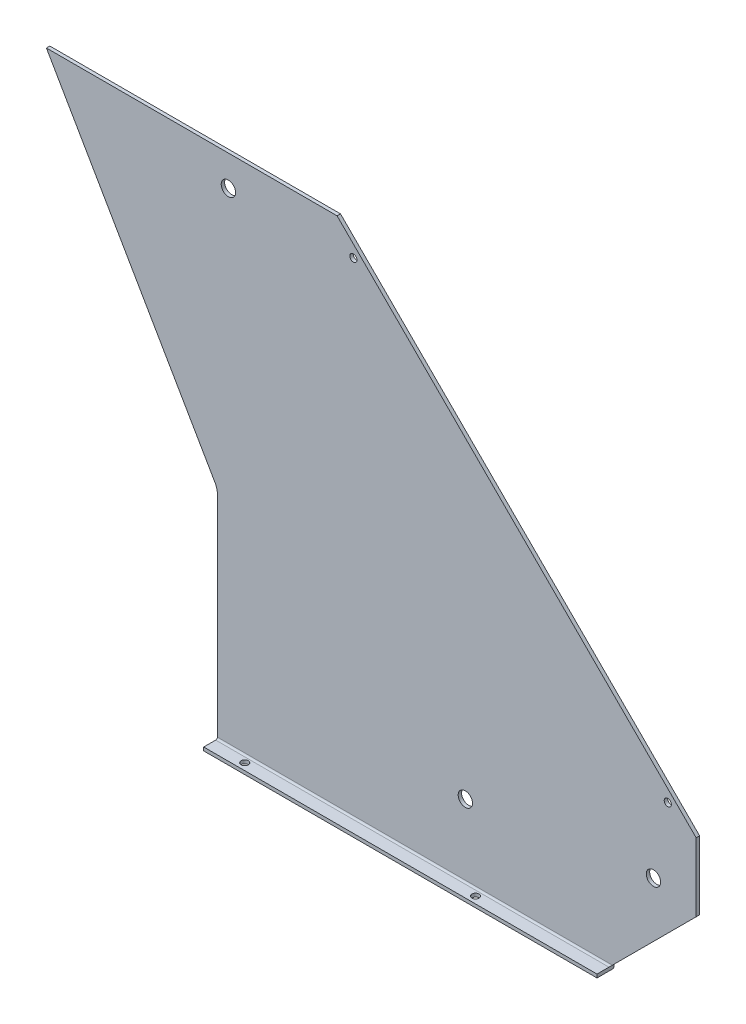
ISO-10303-21;
HEADER;
FILE_DESCRIPTION(('STEP AP214'),'2;1');
FILE_NAME('part.step','',(''),(''),'','','');
FILE_SCHEMA(('AUTOMOTIVE_DESIGN { 1 0 10303 214 1 1 1 1 }'));
ENDSEC;
DATA;
#1=APPLICATION_CONTEXT('core data for automotive mechanical design processes');
#2=APPLICATION_PROTOCOL_DEFINITION('international standard','automotive_design',2000,#1);
#3=PRODUCT_CONTEXT('',#1,'mechanical');
#4=PRODUCT('Part','Part','',(#3));
#5=PRODUCT_RELATED_PRODUCT_CATEGORY('part','',(#4));
#6=PRODUCT_DEFINITION_FORMATION('','',#4);
#7=PRODUCT_DEFINITION_CONTEXT('part definition',#1,'design');
#8=PRODUCT_DEFINITION('design','',#6,#7);
#9=PRODUCT_DEFINITION_SHAPE('','',#8);
#10=(LENGTH_UNIT() NAMED_UNIT(*) SI_UNIT(.MILLI.,.METRE.));
#11=(NAMED_UNIT(*) PLANE_ANGLE_UNIT() SI_UNIT($,.RADIAN.));
#12=(NAMED_UNIT(*) SI_UNIT($,.STERADIAN.) SOLID_ANGLE_UNIT());
#13=UNCERTAINTY_MEASURE_WITH_UNIT(LENGTH_MEASURE(1.E-05),#10,'distance_accuracy_value','');
#14=(GEOMETRIC_REPRESENTATION_CONTEXT(3) GLOBAL_UNCERTAINTY_ASSIGNED_CONTEXT((#13)) GLOBAL_UNIT_ASSIGNED_CONTEXT((#10,
#11,#12)) REPRESENTATION_CONTEXT('',''));
#15=CARTESIAN_POINT('',(0.,0.,0.));
#16=DIRECTION('',(0.,0.,1.));
#17=DIRECTION('',(1.,0.,0.));
#18=AXIS2_PLACEMENT_3D('',#15,#16,#17);
#19=CARTESIAN_POINT('',(0.,150.,2.));
#20=DIRECTION('',(0.,-1.,0.));
#21=DIRECTION('',(0.,0.,-1.));
#22=AXIS2_PLACEMENT_3D('',#19,#20,#21);
#23=PLANE('',#22);
#24=DIRECTION('',(-1.,0.,0.));
#25=VECTOR('',#24,1.);
#26=CARTESIAN_POINT('',(0.,150.,0.));
#27=LINE('',#26,#25);
#28=CARTESIAN_POINT('',(-70.,150.,0.));
#29=VERTEX_POINT('',#28);
#30=CARTESIAN_POINT('',(-240.,150.,0.));
#31=VERTEX_POINT('',#30);
#32=EDGE_CURVE('E179',#29,#31,#27,.T.);
#33=ORIENTED_EDGE('',*,*,#32,.T.);
#34=DIRECTION('',(0.,0.,-1.));
#35=VECTOR('',#34,1.);
#36=CARTESIAN_POINT('',(-240.,150.,2.));
#37=LINE('',#36,#35);
#38=CARTESIAN_POINT('',(-240.,150.,2.));
#39=VERTEX_POINT('',#38);
#40=EDGE_CURVE('E200',#39,#31,#37,.T.);
#41=ORIENTED_EDGE('',*,*,#40,.F.);
#42=DIRECTION('',(-1.,0.,0.));
#43=VECTOR('',#42,1.);
#44=CARTESIAN_POINT('',(0.,150.,2.));
#45=LINE('',#44,#43);
#46=CARTESIAN_POINT('',(-70.,150.,2.));
#47=VERTEX_POINT('',#46);
#48=EDGE_CURVE('E164',#47,#39,#45,.T.);
#49=ORIENTED_EDGE('',*,*,#48,.F.);
#50=DIRECTION('',(0.,0.,-1.));
#51=VECTOR('',#50,1.);
#52=CARTESIAN_POINT('',(-70.,150.,2.));
#53=LINE('',#52,#51);
#54=EDGE_CURVE('E178',#47,#29,#53,.T.);
#55=ORIENTED_EDGE('',*,*,#54,.T.);
#56=EDGE_LOOP('',(#33,#41,#49,#55));
#57=FACE_BOUND('',#56,.T.);
#58=ADVANCED_FACE('F35',(#57),#23,.F.);
#59=CARTESIAN_POINT('',(-115.048094716168,-66.4230484541327,2.));
#60=DIRECTION('',(0.86602540378444,0.499999999999998,0.));
#61=DIRECTION('',(-0.499999999999998,0.86602540378444,0.));
#62=AXIS2_PLACEMENT_3D('',#59,#60,#61);
#63=PLANE('',#62);
#64=DIRECTION('',(0.499999999999998,-0.86602540378444,0.));
#65=VECTOR('',#64,1.);
#66=CARTESIAN_POINT('',(-115.048094716168,-66.4230484541327,0.));
#67=LINE('',#66,#65);
#68=CARTESIAN_POINT('',(-141.339745962156,-20.8845726812,0.));
#69=VERTEX_POINT('',#68);
#70=EDGE_CURVE('E182',#31,#69,#67,.T.);
#71=ORIENTED_EDGE('',*,*,#70,.T.);
#72=DIRECTION('',(0.,0.,-1.));
#73=VECTOR('',#72,1.);
#74=CARTESIAN_POINT('',(-141.339745962156,-20.8845726812,2.));
#75=LINE('',#74,#73);
#76=CARTESIAN_POINT('',(-141.339745962156,-20.8845726812,2.));
#77=VERTEX_POINT('',#76);
#78=EDGE_CURVE('E50',#69,#77,#75,.F.);
#79=ORIENTED_EDGE('',*,*,#78,.T.);
#80=DIRECTION('',(0.499999999999998,-0.86602540378444,0.));
#81=VECTOR('',#80,1.);
#82=CARTESIAN_POINT('',(-115.048094716168,-66.4230484541327,2.));
#83=LINE('',#82,#81);
#84=EDGE_CURVE('E167',#39,#77,#83,.T.);
#85=ORIENTED_EDGE('',*,*,#84,.F.);
#86=ORIENTED_EDGE('',*,*,#40,.T.);
#87=EDGE_LOOP('',(#71,#79,#85,#86));
#88=FACE_BOUND('',#87,.T.);
#89=ADVANCED_FACE('F320',(#88),#63,.F.);
#90=CARTESIAN_POINT('',(-140.,0.,2.));
#91=DIRECTION('',(1.,0.,0.));
#92=DIRECTION('',(0.,1.,0.));
#93=AXIS2_PLACEMENT_3D('',#90,#91,#92);
#94=PLANE('',#93);
#95=DIRECTION('',(0.,-1.,0.));
#96=VECTOR('',#95,1.);
#97=CARTESIAN_POINT('',(-140.,0.,2.));
#98=LINE('',#97,#96);
#99=CARTESIAN_POINT('',(-140.,-25.8845726812,2.));
#100=VERTEX_POINT('',#99);
#101=CARTESIAN_POINT('',(-140.,-149.,2.));
#102=VERTEX_POINT('',#101);
#103=EDGE_CURVE('E170',#100,#102,#98,.T.);
#104=ORIENTED_EDGE('',*,*,#103,.F.);
#105=DIRECTION('',(0.,0.,-1.));
#106=VECTOR('',#105,1.);
#107=CARTESIAN_POINT('',(-140.,-25.8845726812,0.));
#108=LINE('',#107,#106);
#109=CARTESIAN_POINT('',(-140.,-25.8845726812,0.));
#110=VERTEX_POINT('',#109);
#111=EDGE_CURVE('E219',#100,#110,#108,.T.);
#112=ORIENTED_EDGE('',*,*,#111,.T.);
#113=DIRECTION('',(0.,-1.,0.));
#114=VECTOR('',#113,1.);
#115=CARTESIAN_POINT('',(-140.,0.,0.));
#116=LINE('',#115,#114);
#117=CARTESIAN_POINT('',(-140.,-151.,0.));
#118=VERTEX_POINT('',#117);
#119=EDGE_CURVE('E184',#110,#118,#116,.T.);
#120=ORIENTED_EDGE('',*,*,#119,.T.);
#121=CARTESIAN_POINT('',(-140.,-151.,1.));
#122=DIRECTION('',(1.,0.,0.));
#123=DIRECTION('',(0.,1.,0.));
#124=AXIS2_PLACEMENT_3D('',#121,#122,#123);
#125=CIRCLE('',#124,1.);
#126=CARTESIAN_POINT('',(-140.,-152.,1.));
#127=VERTEX_POINT('',#126);
#128=EDGE_CURVE('E238',#118,#127,#125,.F.);
#129=ORIENTED_EDGE('',*,*,#128,.T.);
#130=DIRECTION('',(0.,0.,-1.));
#131=VECTOR('',#130,1.);
#132=CARTESIAN_POINT('',(-140.,-152.,0.));
#133=LINE('',#132,#131);
#134=CARTESIAN_POINT('',(-140.,-152.,10.));
#135=VERTEX_POINT('',#134);
#136=EDGE_CURVE('E135',#135,#127,#133,.T.);
#137=ORIENTED_EDGE('',*,*,#136,.F.);
#138=DIRECTION('',(0.,1.,0.));
#139=VECTOR('',#138,1.);
#140=CARTESIAN_POINT('',(-140.,-152.,10.));
#141=LINE('',#140,#139);
#142=CARTESIAN_POINT('',(-140.,-150.,10.));
#143=VERTEX_POINT('',#142);
#144=EDGE_CURVE('E145',#135,#143,#141,.T.);
#145=ORIENTED_EDGE('',*,*,#144,.T.);
#146=DIRECTION('',(0.,0.,-1.));
#147=VECTOR('',#146,1.);
#148=CARTESIAN_POINT('',(-140.,-150.,0.));
#149=LINE('',#148,#147);
#150=CARTESIAN_POINT('',(-140.,-150.,3.));
#151=VERTEX_POINT('',#150);
#152=EDGE_CURVE('E159',#143,#151,#149,.T.);
#153=ORIENTED_EDGE('',*,*,#152,.T.);
#154=CARTESIAN_POINT('',(-140.,-149.,3.));
#155=DIRECTION('',(1.,0.,0.));
#156=DIRECTION('',(0.,1.,0.));
#157=AXIS2_PLACEMENT_3D('',#154,#155,#156);
#158=CIRCLE('',#157,1.);
#159=EDGE_CURVE('E217',#151,#102,#158,.T.);
#160=ORIENTED_EDGE('',*,*,#159,.T.);
#161=EDGE_LOOP('',(#104,#112,#120,#129,#137,#145,#153,#160));
#162=FACE_BOUND('',#161,.T.);
#163=ADVANCED_FACE('F327',(#162),#94,.F.);
#164=CARTESIAN_POINT('',(120.,-120.,2.));
#165=DIRECTION('',(0.707106781186547,-0.707106781186547,0.));
#166=DIRECTION('',(0.707106781186548,0.707106781186548,0.));
#167=AXIS2_PLACEMENT_3D('',#164,#165,#166);
#168=PLANE('',#167);
#169=DIRECTION('',(-0.707106781186548,-0.707106781186548,0.));
#170=VECTOR('',#169,1.);
#171=CARTESIAN_POINT('',(120.,-120.,0.));
#172=LINE('',#171,#170);
#173=CARTESIAN_POINT('',(140.,-100.,0.));
#174=VERTEX_POINT('',#173);
#175=CARTESIAN_POINT('',(90.0000000000001,-150.,0.));
#176=VERTEX_POINT('',#175);
#177=EDGE_CURVE('E186',#174,#176,#172,.T.);
#178=ORIENTED_EDGE('',*,*,#177,.F.);
#179=DIRECTION('',(0.,0.,-1.));
#180=VECTOR('',#179,1.);
#181=CARTESIAN_POINT('',(140.,-100.,2.));
#182=LINE('',#181,#180);
#183=CARTESIAN_POINT('',(140.,-100.,2.));
#184=VERTEX_POINT('',#183);
#185=EDGE_CURVE('E197',#184,#174,#182,.T.);
#186=ORIENTED_EDGE('',*,*,#185,.F.);
#187=DIRECTION('',(-0.707106781186548,-0.707106781186548,0.));
#188=VECTOR('',#187,1.);
#189=CARTESIAN_POINT('',(120.,-120.,2.));
#190=LINE('',#189,#188);
#191=CARTESIAN_POINT('',(91.0000000000001,-149.,2.));
#192=VERTEX_POINT('',#191);
#193=EDGE_CURVE('E175',#184,#192,#190,.T.);
#194=ORIENTED_EDGE('',*,*,#193,.T.);
#195=CARTESIAN_POINT('',(91.0000000000001,-149.,3.));
#196=DIRECTION('',(0.707106781186547,-0.707106781186547,0.));
#197=DIRECTION('',(-0.707106781186548,-0.707106781186548,0.));
#198=AXIS2_PLACEMENT_3D('',#195,#196,#197);
#199=ELLIPSE('',#198,1.4142135623731,1.);
#200=CARTESIAN_POINT('',(90.0000000000001,-150.,3.));
#201=VERTEX_POINT('',#200);
#202=EDGE_CURVE('E226',#192,#201,#199,.F.);
#203=ORIENTED_EDGE('',*,*,#202,.T.);
#204=DIRECTION('',(0.,0.,-1.));
#205=VECTOR('',#204,1.);
#206=CARTESIAN_POINT('',(90.0000000000001,-150.,2.));
#207=LINE('',#206,#205);
#208=EDGE_CURVE('E199',#201,#176,#207,.T.);
#209=ORIENTED_EDGE('',*,*,#208,.T.);
#210=EDGE_LOOP('',(#178,#186,#194,#203,#209));
#211=FACE_BOUND('',#210,.T.);
#212=ADVANCED_FACE('F347',(#211),#168,.T.);
#213=CARTESIAN_POINT('',(140.,0.,2.));
#214=DIRECTION('',(1.,0.,0.));
#215=DIRECTION('',(0.,1.,0.));
#216=AXIS2_PLACEMENT_3D('',#213,#214,#215);
#217=PLANE('',#216);
#218=DIRECTION('',(0.,-1.,0.));
#219=VECTOR('',#218,1.);
#220=CARTESIAN_POINT('',(140.,0.,0.));
#221=LINE('',#220,#219);
#222=CARTESIAN_POINT('',(140.,-60.0000000000008,0.));
#223=VERTEX_POINT('',#222);
#224=EDGE_CURVE('E189',#223,#174,#221,.T.);
#225=ORIENTED_EDGE('',*,*,#224,.F.);
#226=DIRECTION('',(0.,0.,-1.));
#227=VECTOR('',#226,1.);
#228=CARTESIAN_POINT('',(140.,-60.0000000000008,2.));
#229=LINE('',#228,#227);
#230=CARTESIAN_POINT('',(140.,-60.0000000000008,2.));
#231=VERTEX_POINT('',#230);
#232=EDGE_CURVE('E195',#231,#223,#229,.T.);
#233=ORIENTED_EDGE('',*,*,#232,.F.);
#234=DIRECTION('',(0.,-1.,0.));
#235=VECTOR('',#234,1.);
#236=CARTESIAN_POINT('',(140.,0.,2.));
#237=LINE('',#236,#235);
#238=EDGE_CURVE('E171',#231,#184,#237,.T.);
#239=ORIENTED_EDGE('',*,*,#238,.T.);
#240=ORIENTED_EDGE('',*,*,#185,.T.);
#241=EDGE_LOOP('',(#225,#233,#239,#240));
#242=FACE_BOUND('',#241,.T.);
#243=ADVANCED_FACE('F350',(#242),#217,.T.);
#244=CARTESIAN_POINT('',(39.9999999999999,39.9999999999998,2.));
#245=DIRECTION('',(0.707106781186549,0.707106781186546,0.));
#246=DIRECTION('',(-0.707106781186546,0.707106781186549,0.));
#247=AXIS2_PLACEMENT_3D('',#244,#245,#246);
#248=PLANE('',#247);
#249=DIRECTION('',(0.707106781186546,-0.707106781186549,0.));
#250=VECTOR('',#249,1.);
#251=CARTESIAN_POINT('',(39.9999999999999,39.9999999999998,0.));
#252=LINE('',#251,#250);
#253=EDGE_CURVE('E168',#29,#223,#252,.T.);
#254=ORIENTED_EDGE('',*,*,#253,.F.);
#255=ORIENTED_EDGE('',*,*,#54,.F.);
#256=DIRECTION('',(0.707106781186546,-0.707106781186549,0.));
#257=VECTOR('',#256,1.);
#258=CARTESIAN_POINT('',(39.9999999999999,39.9999999999998,2.));
#259=LINE('',#258,#257);
#260=EDGE_CURVE('E174',#47,#231,#259,.T.);
#261=ORIENTED_EDGE('',*,*,#260,.T.);
#262=ORIENTED_EDGE('',*,*,#232,.T.);
#263=EDGE_LOOP('',(#254,#255,#261,#262));
#264=FACE_BOUND('',#263,.T.);
#265=ADVANCED_FACE('F301',(#264),#248,.T.);
#266=CARTESIAN_POINT('',(0.,0.,2.));
#267=DIRECTION('',(0.,0.,1.));
#268=DIRECTION('',(1.,0.,0.));
#269=AXIS2_PLACEMENT_3D('',#266,#267,#268);
#270=PLANE('',#269);
#271=CARTESIAN_POINT('',(-60.4594154601837,133.388347648318,2.));
#272=DIRECTION('',(0.,0.,1.));
#273=DIRECTION('',(1.,0.,0.));
#274=AXIS2_PLACEMENT_3D('',#271,#272,#273);
#275=CIRCLE('',#274,2.1);
#276=CARTESIAN_POINT('',(-58.3594154601837,133.388347648318,2.));
#277=VERTEX_POINT('',#276);
#278=EDGE_CURVE('E282',#277,#277,#275,.T.);
#279=ORIENTED_EDGE('',*,*,#278,.F.);
#280=EDGE_LOOP('',(#279));
#281=FACE_BOUND('',#280,.T.);
#282=CARTESIAN_POINT('',(123.388347648318,-50.4594154601845,2.));
#283=DIRECTION('',(0.,0.,1.));
#284=DIRECTION('',(1.,0.,0.));
#285=AXIS2_PLACEMENT_3D('',#282,#283,#284);
#286=CIRCLE('',#285,2.10000000000002);
#287=CARTESIAN_POINT('',(125.488347648318,-50.4594154601845,2.));
#288=VERTEX_POINT('',#287);
#289=EDGE_CURVE('E276',#288,#288,#286,.T.);
#290=ORIENTED_EDGE('',*,*,#289,.F.);
#291=EDGE_LOOP('',(#290));
#292=FACE_BOUND('',#291,.T.);
#293=CARTESIAN_POINT('',(115.,-92.89246887,2.));
#294=DIRECTION('',(0.,0.,1.));
#295=DIRECTION('',(1.,0.,0.));
#296=AXIS2_PLACEMENT_3D('',#293,#294,#295);
#297=CIRCLE('',#296,4.19999999999999);
#298=CARTESIAN_POINT('',(119.2,-92.89246887,2.));
#299=VERTEX_POINT('',#298);
#300=EDGE_CURVE('E258',#299,#299,#297,.T.);
#301=ORIENTED_EDGE('',*,*,#300,.F.);
#302=EDGE_LOOP('',(#301));
#303=FACE_BOUND('',#302,.T.);
#304=CARTESIAN_POINT('',(4.99999999999995,-107.89246887,2.));
#305=DIRECTION('',(0.,0.,1.));
#306=DIRECTION('',(1.,0.,0.));
#307=AXIS2_PLACEMENT_3D('',#304,#305,#306);
#308=CIRCLE('',#307,4.2);
#309=CARTESIAN_POINT('',(9.19999999999995,-107.89246887,2.));
#310=VERTEX_POINT('',#309);
#311=EDGE_CURVE('E252',#310,#310,#308,.T.);
#312=ORIENTED_EDGE('',*,*,#311,.F.);
#313=EDGE_LOOP('',(#312));
#314=FACE_BOUND('',#313,.T.);
#315=CARTESIAN_POINT('',(-133.564064605509,132.10753113,2.));
#316=DIRECTION('',(0.,0.,1.));
#317=DIRECTION('',(1.,0.,0.));
#318=AXIS2_PLACEMENT_3D('',#315,#316,#317);
#319=CIRCLE('',#318,4.20000000000001);
#320=CARTESIAN_POINT('',(-129.364064605509,132.10753113,2.));
#321=VERTEX_POINT('',#320);
#322=EDGE_CURVE('E246',#321,#321,#319,.T.);
#323=ORIENTED_EDGE('',*,*,#322,.F.);
#324=EDGE_LOOP('',(#323));
#325=FACE_BOUND('',#324,.T.);
#326=ORIENTED_EDGE('',*,*,#84,.T.);
#327=CARTESIAN_POINT('',(-150.,-25.8845726812,2.));
#328=DIRECTION('',(0.,0.,1.));
#329=DIRECTION('',(1.,0.,0.));
#330=AXIS2_PLACEMENT_3D('',#327,#328,#329);
#331=CIRCLE('',#330,10.);
#332=EDGE_CURVE('E11',#77,#100,#331,.F.);
#333=ORIENTED_EDGE('',*,*,#332,.T.);
#334=ORIENTED_EDGE('',*,*,#103,.T.);
#335=DIRECTION('',(1.,0.,0.));
#336=VECTOR('',#335,1.);
#337=CARTESIAN_POINT('',(90.0000000000001,-149.,2.));
#338=LINE('',#337,#336);
#339=EDGE_CURVE('E233',#102,#192,#338,.T.);
#340=ORIENTED_EDGE('',*,*,#339,.T.);
#341=ORIENTED_EDGE('',*,*,#193,.F.);
#342=ORIENTED_EDGE('',*,*,#238,.F.);
#343=ORIENTED_EDGE('',*,*,#260,.F.);
#344=ORIENTED_EDGE('',*,*,#48,.T.);
#345=EDGE_LOOP('',(#326,#333,#334,#340,#341,#342,#343,#344));
#346=FACE_BOUND('',#345,.T.);
#347=ADVANCED_FACE('F298',(#281,#292,#303,#314,#325,#346),#270,.T.);
#348=CARTESIAN_POINT('',(0.,0.,0.));
#349=DIRECTION('',(0.,0.,1.));
#350=DIRECTION('',(1.,0.,0.));
#351=AXIS2_PLACEMENT_3D('',#348,#349,#350);
#352=PLANE('',#351);
#353=CARTESIAN_POINT('',(-60.4594154601837,133.388347648318,0.));
#354=DIRECTION('',(0.,0.,1.));
#355=DIRECTION('',(1.,0.,0.));
#356=AXIS2_PLACEMENT_3D('',#353,#354,#355);
#357=CIRCLE('',#356,2.1);
#358=CARTESIAN_POINT('',(-58.3594154601837,133.388347648318,0.));
#359=VERTEX_POINT('',#358);
#360=EDGE_CURVE('E279',#359,#359,#357,.T.);
#361=ORIENTED_EDGE('',*,*,#360,.T.);
#362=EDGE_LOOP('',(#361));
#363=FACE_BOUND('',#362,.T.);
#364=CARTESIAN_POINT('',(123.388347648318,-50.4594154601845,0.));
#365=DIRECTION('',(0.,0.,1.));
#366=DIRECTION('',(1.,0.,0.));
#367=AXIS2_PLACEMENT_3D('',#364,#365,#366);
#368=CIRCLE('',#367,2.10000000000002);
#369=CARTESIAN_POINT('',(125.488347648318,-50.4594154601845,0.));
#370=VERTEX_POINT('',#369);
#371=EDGE_CURVE('E273',#370,#370,#368,.T.);
#372=ORIENTED_EDGE('',*,*,#371,.T.);
#373=EDGE_LOOP('',(#372));
#374=FACE_BOUND('',#373,.T.);
#375=CARTESIAN_POINT('',(115.,-92.89246887,0.));
#376=DIRECTION('',(0.,0.,1.));
#377=DIRECTION('',(1.,0.,0.));
#378=AXIS2_PLACEMENT_3D('',#375,#376,#377);
#379=CIRCLE('',#378,4.19999999999999);
#380=CARTESIAN_POINT('',(119.2,-92.89246887,0.));
#381=VERTEX_POINT('',#380);
#382=EDGE_CURVE('E255',#381,#381,#379,.T.);
#383=ORIENTED_EDGE('',*,*,#382,.T.);
#384=EDGE_LOOP('',(#383));
#385=FACE_BOUND('',#384,.T.);
#386=CARTESIAN_POINT('',(4.99999999999995,-107.89246887,0.));
#387=DIRECTION('',(0.,0.,1.));
#388=DIRECTION('',(1.,0.,0.));
#389=AXIS2_PLACEMENT_3D('',#386,#387,#388);
#390=CIRCLE('',#389,4.2);
#391=CARTESIAN_POINT('',(9.19999999999995,-107.89246887,0.));
#392=VERTEX_POINT('',#391);
#393=EDGE_CURVE('E249',#392,#392,#390,.T.);
#394=ORIENTED_EDGE('',*,*,#393,.T.);
#395=EDGE_LOOP('',(#394));
#396=FACE_BOUND('',#395,.T.);
#397=CARTESIAN_POINT('',(-133.564064605509,132.10753113,0.));
#398=DIRECTION('',(0.,0.,1.));
#399=DIRECTION('',(1.,0.,0.));
#400=AXIS2_PLACEMENT_3D('',#397,#398,#399);
#401=CIRCLE('',#400,4.20000000000001);
#402=CARTESIAN_POINT('',(-129.364064605509,132.10753113,0.));
#403=VERTEX_POINT('',#402);
#404=EDGE_CURVE('E163',#403,#403,#401,.T.);
#405=ORIENTED_EDGE('',*,*,#404,.T.);
#406=EDGE_LOOP('',(#405));
#407=FACE_BOUND('',#406,.T.);
#408=DIRECTION('',(0.,1.,0.));
#409=VECTOR('',#408,1.);
#410=CARTESIAN_POINT('',(90.0000000000001,-152.,0.));
#411=LINE('',#410,#409);
#412=CARTESIAN_POINT('',(90.0000000000001,-151.,0.));
#413=VERTEX_POINT('',#412);
#414=EDGE_CURVE('E144',#413,#176,#411,.T.);
#415=ORIENTED_EDGE('',*,*,#414,.F.);
#416=DIRECTION('',(1.,0.,0.));
#417=VECTOR('',#416,1.);
#418=CARTESIAN_POINT('',(0.,-151.,0.));
#419=LINE('',#418,#417);
#420=EDGE_CURVE('E240',#413,#118,#419,.F.);
#421=ORIENTED_EDGE('',*,*,#420,.T.);
#422=ORIENTED_EDGE('',*,*,#119,.F.);
#423=CARTESIAN_POINT('',(-150.,-25.8845726812,0.));
#424=DIRECTION('',(0.,0.,1.));
#425=DIRECTION('',(1.,0.,0.));
#426=AXIS2_PLACEMENT_3D('',#423,#424,#425);
#427=CIRCLE('',#426,10.);
#428=EDGE_CURVE('E43',#110,#69,#427,.T.);
#429=ORIENTED_EDGE('',*,*,#428,.T.);
#430=ORIENTED_EDGE('',*,*,#70,.F.);
#431=ORIENTED_EDGE('',*,*,#32,.F.);
#432=ORIENTED_EDGE('',*,*,#253,.T.);
#433=ORIENTED_EDGE('',*,*,#224,.T.);
#434=ORIENTED_EDGE('',*,*,#177,.T.);
#435=EDGE_LOOP('',(#415,#421,#422,#429,#430,#431,#432,#433,#434));
#436=FACE_BOUND('',#435,.T.);
#437=ADVANCED_FACE('F288',(#363,#374,#385,#396,#407,#436),#352,.F.);
#438=CARTESIAN_POINT('',(0.,-150.,0.));
#439=DIRECTION('',(0.,1.,0.));
#440=DIRECTION('',(0.,0.,1.));
#441=AXIS2_PLACEMENT_3D('',#438,#439,#440);
#442=PLANE('',#441);
#443=CARTESIAN_POINT('',(-120.,-150.,6.00000000000002));
#444=DIRECTION('',(0.,1.,0.));
#445=DIRECTION('',(0.,0.,1.));
#446=AXIS2_PLACEMENT_3D('',#443,#444,#445);
#447=CIRCLE('',#446,2.1);
#448=CARTESIAN_POINT('',(-120.,-150.,8.10000000000003));
#449=VERTEX_POINT('',#448);
#450=EDGE_CURVE('E270',#449,#449,#447,.T.);
#451=ORIENTED_EDGE('',*,*,#450,.F.);
#452=EDGE_LOOP('',(#451));
#453=FACE_BOUND('',#452,.T.);
#454=CARTESIAN_POINT('',(15.0000000000001,-150.,6.00000000000001));
#455=DIRECTION('',(0.,1.,0.));
#456=DIRECTION('',(0.,0.,1.));
#457=AXIS2_PLACEMENT_3D('',#454,#455,#456);
#458=CIRCLE('',#457,2.1);
#459=CARTESIAN_POINT('',(15.0000000000001,-150.,8.10000000000001));
#460=VERTEX_POINT('',#459);
#461=EDGE_CURVE('E264',#460,#460,#458,.T.);
#462=ORIENTED_EDGE('',*,*,#461,.F.);
#463=EDGE_LOOP('',(#462));
#464=FACE_BOUND('',#463,.T.);
#465=DIRECTION('',(0.,0.,1.));
#466=VECTOR('',#465,1.);
#467=CARTESIAN_POINT('',(90.0000000000001,-150.,0.));
#468=LINE('',#467,#466);
#469=CARTESIAN_POINT('',(90.0000000000001,-150.,10.));
#470=VERTEX_POINT('',#469);
#471=EDGE_CURVE('E141',#201,#470,#468,.T.);
#472=ORIENTED_EDGE('',*,*,#471,.F.);
#473=DIRECTION('',(1.,0.,0.));
#474=VECTOR('',#473,1.);
#475=CARTESIAN_POINT('',(-140.,-150.,3.));
#476=LINE('',#475,#474);
#477=EDGE_CURVE('E230',#201,#151,#476,.F.);
#478=ORIENTED_EDGE('',*,*,#477,.T.);
#479=ORIENTED_EDGE('',*,*,#152,.F.);
#480=DIRECTION('',(-1.,0.,0.));
#481=VECTOR('',#480,1.);
#482=CARTESIAN_POINT('',(-140.,-150.,10.));
#483=LINE('',#482,#481);
#484=EDGE_CURVE('E244',#470,#143,#483,.T.);
#485=ORIENTED_EDGE('',*,*,#484,.F.);
#486=EDGE_LOOP('',(#472,#478,#479,#485));
#487=FACE_BOUND('',#486,.T.);
#488=ADVANCED_FACE('F359',(#453,#464,#487),#442,.T.);
#489=CARTESIAN_POINT('',(90.0000000000001,-152.,0.));
#490=DIRECTION('',(-1.,0.,0.));
#491=DIRECTION('',(0.,0.,1.));
#492=AXIS2_PLACEMENT_3D('',#489,#490,#491);
#493=PLANE('',#492);
#494=DIRECTION('',(0.,0.,1.));
#495=VECTOR('',#494,1.);
#496=CARTESIAN_POINT('',(90.0000000000001,-152.,0.));
#497=LINE('',#496,#495);
#498=CARTESIAN_POINT('',(90.0000000000001,-152.,1.));
#499=VERTEX_POINT('',#498);
#500=CARTESIAN_POINT('',(90.0000000000001,-152.,10.));
#501=VERTEX_POINT('',#500);
#502=EDGE_CURVE('E125',#499,#501,#497,.T.);
#503=ORIENTED_EDGE('',*,*,#502,.F.);
#504=CARTESIAN_POINT('',(90.0000000000001,-151.,1.));
#505=DIRECTION('',(-1.,0.,0.));
#506=DIRECTION('',(0.,0.,1.));
#507=AXIS2_PLACEMENT_3D('',#504,#505,#506);
#508=CIRCLE('',#507,1.);
#509=EDGE_CURVE('E243',#499,#413,#508,.F.);
#510=ORIENTED_EDGE('',*,*,#509,.T.);
#511=ORIENTED_EDGE('',*,*,#414,.T.);
#512=ORIENTED_EDGE('',*,*,#208,.F.);
#513=ORIENTED_EDGE('',*,*,#471,.T.);
#514=DIRECTION('',(0.,1.,0.));
#515=VECTOR('',#514,1.);
#516=CARTESIAN_POINT('',(90.0000000000001,-152.,10.));
#517=LINE('',#516,#515);
#518=EDGE_CURVE('E138',#501,#470,#517,.T.);
#519=ORIENTED_EDGE('',*,*,#518,.F.);
#520=EDGE_LOOP('',(#503,#510,#511,#512,#513,#519));
#521=FACE_BOUND('',#520,.T.);
#522=ADVANCED_FACE('F139',(#521),#493,.F.);
#523=CARTESIAN_POINT('',(-140.,-152.,10.));
#524=DIRECTION('',(0.,0.,-1.));
#525=DIRECTION('',(-1.,0.,0.));
#526=AXIS2_PLACEMENT_3D('',#523,#524,#525);
#527=PLANE('',#526);
#528=ORIENTED_EDGE('',*,*,#484,.T.);
#529=ORIENTED_EDGE('',*,*,#144,.F.);
#530=DIRECTION('',(-1.,0.,0.));
#531=VECTOR('',#530,1.);
#532=CARTESIAN_POINT('',(-140.,-152.,10.));
#533=LINE('',#532,#531);
#534=EDGE_CURVE('E130',#501,#135,#533,.T.);
#535=ORIENTED_EDGE('',*,*,#534,.F.);
#536=ORIENTED_EDGE('',*,*,#518,.T.);
#537=EDGE_LOOP('',(#528,#529,#535,#536));
#538=FACE_BOUND('',#537,.T.);
#539=ADVANCED_FACE('F147',(#538),#527,.F.);
#540=CARTESIAN_POINT('',(0.,-152.,0.));
#541=DIRECTION('',(0.,1.,0.));
#542=DIRECTION('',(0.,0.,1.));
#543=AXIS2_PLACEMENT_3D('',#540,#541,#542);
#544=PLANE('',#543);
#545=CARTESIAN_POINT('',(-120.,-152.,6.00000000000002));
#546=DIRECTION('',(0.,1.,0.));
#547=DIRECTION('',(0.,0.,1.));
#548=AXIS2_PLACEMENT_3D('',#545,#546,#547);
#549=CIRCLE('',#548,2.1);
#550=CARTESIAN_POINT('',(-120.,-152.,8.10000000000003));
#551=VERTEX_POINT('',#550);
#552=EDGE_CURVE('E267',#551,#551,#549,.T.);
#553=ORIENTED_EDGE('',*,*,#552,.T.);
#554=EDGE_LOOP('',(#553));
#555=FACE_BOUND('',#554,.T.);
#556=CARTESIAN_POINT('',(15.0000000000001,-152.,6.00000000000001));
#557=DIRECTION('',(0.,1.,0.));
#558=DIRECTION('',(0.,0.,1.));
#559=AXIS2_PLACEMENT_3D('',#556,#557,#558);
#560=CIRCLE('',#559,2.1);
#561=CARTESIAN_POINT('',(15.0000000000001,-152.,8.10000000000001));
#562=VERTEX_POINT('',#561);
#563=EDGE_CURVE('E261',#562,#562,#560,.T.);
#564=ORIENTED_EDGE('',*,*,#563,.T.);
#565=EDGE_LOOP('',(#564));
#566=FACE_BOUND('',#565,.T.);
#567=ORIENTED_EDGE('',*,*,#136,.T.);
#568=DIRECTION('',(1.,0.,0.));
#569=VECTOR('',#568,1.);
#570=CARTESIAN_POINT('',(0.,-152.,1.));
#571=LINE('',#570,#569);
#572=EDGE_CURVE('E133',#127,#499,#571,.T.);
#573=ORIENTED_EDGE('',*,*,#572,.T.);
#574=ORIENTED_EDGE('',*,*,#502,.T.);
#575=ORIENTED_EDGE('',*,*,#534,.T.);
#576=EDGE_LOOP('',(#567,#573,#574,#575));
#577=FACE_BOUND('',#576,.T.);
#578=ADVANCED_FACE('F128',(#555,#566,#577),#544,.F.);
#579=CARTESIAN_POINT('',(0.,-151.,1.));
#580=DIRECTION('',(1.,0.,0.));
#581=DIRECTION('',(0.,0.,-1.));
#582=AXIS2_PLACEMENT_3D('',#579,#580,#581);
#583=CYLINDRICAL_SURFACE('',#582,1.);
#584=ORIENTED_EDGE('',*,*,#128,.F.);
#585=ORIENTED_EDGE('',*,*,#420,.F.);
#586=ORIENTED_EDGE('',*,*,#509,.F.);
#587=ORIENTED_EDGE('',*,*,#572,.F.);
#588=EDGE_LOOP('',(#584,#585,#586,#587));
#589=FACE_BOUND('',#588,.T.);
#590=ADVANCED_FACE('F331',(#589),#583,.T.);
#591=CARTESIAN_POINT('',(0.,-149.,3.));
#592=DIRECTION('',(-1.,0.,0.));
#593=DIRECTION('',(0.,0.,1.));
#594=AXIS2_PLACEMENT_3D('',#591,#592,#593);
#595=CYLINDRICAL_SURFACE('',#594,1.);
#596=ORIENTED_EDGE('',*,*,#159,.F.);
#597=ORIENTED_EDGE('',*,*,#477,.F.);
#598=ORIENTED_EDGE('',*,*,#202,.F.);
#599=ORIENTED_EDGE('',*,*,#339,.F.);
#600=EDGE_LOOP('',(#596,#597,#598,#599));
#601=FACE_BOUND('',#600,.T.);
#602=ADVANCED_FACE('F333',(#601),#595,.F.);
#603=CARTESIAN_POINT('',(-133.564064605509,132.10753113,0.));
#604=DIRECTION('',(0.,0.,1.));
#605=DIRECTION('',(1.,0.,0.));
#606=AXIS2_PLACEMENT_3D('',#603,#604,#605);
#607=CYLINDRICAL_SURFACE('',#606,4.20000000000001);
#608=ORIENTED_EDGE('',*,*,#404,.F.);
#609=EDGE_LOOP('',(#608));
#610=FACE_BOUND('',#609,.T.);
#611=ORIENTED_EDGE('',*,*,#322,.T.);
#612=EDGE_LOOP('',(#611));
#613=FACE_BOUND('',#612,.T.);
#614=ADVANCED_FACE('F336',(#610,#613),#607,.F.);
#615=CARTESIAN_POINT('',(4.99999999999995,-107.89246887,0.));
#616=DIRECTION('',(0.,0.,1.));
#617=DIRECTION('',(1.,0.,0.));
#618=AXIS2_PLACEMENT_3D('',#615,#616,#617);
#619=CYLINDRICAL_SURFACE('',#618,4.2);
#620=ORIENTED_EDGE('',*,*,#393,.F.);
#621=EDGE_LOOP('',(#620));
#622=FACE_BOUND('',#621,.T.);
#623=ORIENTED_EDGE('',*,*,#311,.T.);
#624=EDGE_LOOP('',(#623));
#625=FACE_BOUND('',#624,.T.);
#626=ADVANCED_FACE('F341',(#622,#625),#619,.F.);
#627=CARTESIAN_POINT('',(115.,-92.89246887,0.));
#628=DIRECTION('',(0.,0.,1.));
#629=DIRECTION('',(1.,0.,0.));
#630=AXIS2_PLACEMENT_3D('',#627,#628,#629);
#631=CYLINDRICAL_SURFACE('',#630,4.19999999999999);
#632=ORIENTED_EDGE('',*,*,#382,.F.);
#633=EDGE_LOOP('',(#632));
#634=FACE_BOUND('',#633,.T.);
#635=ORIENTED_EDGE('',*,*,#300,.T.);
#636=EDGE_LOOP('',(#635));
#637=FACE_BOUND('',#636,.T.);
#638=ADVANCED_FACE('F427',(#634,#637),#631,.F.);
#639=CARTESIAN_POINT('',(15.0000000000001,-152.,6.00000000000001));
#640=DIRECTION('',(0.,1.,0.));
#641=DIRECTION('',(0.,0.,1.));
#642=AXIS2_PLACEMENT_3D('',#639,#640,#641);
#643=CYLINDRICAL_SURFACE('',#642,2.1);
#644=ORIENTED_EDGE('',*,*,#563,.F.);
#645=EDGE_LOOP('',(#644));
#646=FACE_BOUND('',#645,.T.);
#647=ORIENTED_EDGE('',*,*,#461,.T.);
#648=EDGE_LOOP('',(#647));
#649=FACE_BOUND('',#648,.T.);
#650=ADVANCED_FACE('F418',(#646,#649),#643,.F.);
#651=CARTESIAN_POINT('',(-120.,-152.,6.00000000000002));
#652=DIRECTION('',(0.,1.,0.));
#653=DIRECTION('',(0.,0.,1.));
#654=AXIS2_PLACEMENT_3D('',#651,#652,#653);
#655=CYLINDRICAL_SURFACE('',#654,2.1);
#656=ORIENTED_EDGE('',*,*,#552,.F.);
#657=EDGE_LOOP('',(#656));
#658=FACE_BOUND('',#657,.T.);
#659=ORIENTED_EDGE('',*,*,#450,.T.);
#660=EDGE_LOOP('',(#659));
#661=FACE_BOUND('',#660,.T.);
#662=ADVANCED_FACE('F409',(#658,#661),#655,.F.);
#663=CARTESIAN_POINT('',(123.388347648318,-50.4594154601845,0.));
#664=DIRECTION('',(0.,0.,1.));
#665=DIRECTION('',(1.,0.,0.));
#666=AXIS2_PLACEMENT_3D('',#663,#664,#665);
#667=CYLINDRICAL_SURFACE('',#666,2.10000000000002);
#668=ORIENTED_EDGE('',*,*,#371,.F.);
#669=EDGE_LOOP('',(#668));
#670=FACE_BOUND('',#669,.T.);
#671=ORIENTED_EDGE('',*,*,#289,.T.);
#672=EDGE_LOOP('',(#671));
#673=FACE_BOUND('',#672,.T.);
#674=ADVANCED_FACE('F294',(#670,#673),#667,.F.);
#675=CARTESIAN_POINT('',(-60.4594154601837,133.388347648318,0.));
#676=DIRECTION('',(0.,0.,1.));
#677=DIRECTION('',(1.,0.,0.));
#678=AXIS2_PLACEMENT_3D('',#675,#676,#677);
#679=CYLINDRICAL_SURFACE('',#678,2.1);
#680=ORIENTED_EDGE('',*,*,#360,.F.);
#681=EDGE_LOOP('',(#680));
#682=FACE_BOUND('',#681,.T.);
#683=ORIENTED_EDGE('',*,*,#278,.T.);
#684=EDGE_LOOP('',(#683));
#685=FACE_BOUND('',#684,.T.);
#686=ADVANCED_FACE('F291',(#682,#685),#679,.F.);
#687=CARTESIAN_POINT('',(-150.,-25.8845726812,2.));
#688=DIRECTION('',(0.,0.,1.));
#689=DIRECTION('',(1.,0.,0.));
#690=AXIS2_PLACEMENT_3D('',#687,#688,#689);
#691=CYLINDRICAL_SURFACE('',#690,10.);
#692=ORIENTED_EDGE('',*,*,#332,.F.);
#693=ORIENTED_EDGE('',*,*,#78,.F.);
#694=ORIENTED_EDGE('',*,*,#428,.F.);
#695=ORIENTED_EDGE('',*,*,#111,.F.);
#696=EDGE_LOOP('',(#692,#693,#694,#695));
#697=FACE_BOUND('',#696,.T.);
#698=ADVANCED_FACE('F37',(#697),#691,.F.);
#699=CLOSED_SHELL('',(#58,#89,#163,#212,#243,#265,#347,#437,#488,#522,#539,#578,#590,#602,#614,
#626,#638,#650,#662,#674,#686,#698));
#700=MANIFOLD_SOLID_BREP('B2',#699);
#701=ADVANCED_BREP_SHAPE_REPRESENTATION('',(#18,#700),#14);
#702=SHAPE_DEFINITION_REPRESENTATION(#9,#701);
ENDSEC;
END-ISO-10303-21;
